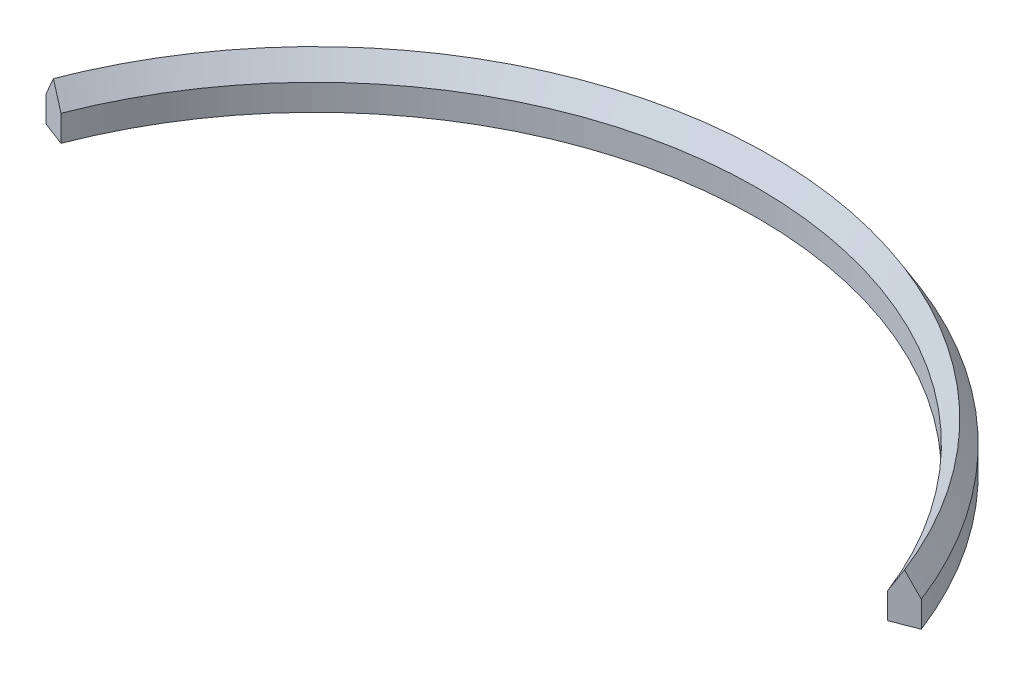
ISO-10303-21;
HEADER;
FILE_DESCRIPTION(('STEP AP214'),'2;1');
FILE_NAME('part.step','',(''),(''),'','','');
FILE_SCHEMA(('AUTOMOTIVE_DESIGN { 1 0 10303 214 1 1 1 1 }'));
ENDSEC;
DATA;
#1=APPLICATION_CONTEXT('core data for automotive mechanical design processes');
#2=APPLICATION_PROTOCOL_DEFINITION('international standard','automotive_design',2000,#1);
#3=PRODUCT_CONTEXT('',#1,'mechanical');
#4=PRODUCT('Part','Part','',(#3));
#5=PRODUCT_RELATED_PRODUCT_CATEGORY('part','',(#4));
#6=PRODUCT_DEFINITION_FORMATION('','',#4);
#7=PRODUCT_DEFINITION_CONTEXT('part definition',#1,'design');
#8=PRODUCT_DEFINITION('design','',#6,#7);
#9=PRODUCT_DEFINITION_SHAPE('','',#8);
#10=(LENGTH_UNIT() NAMED_UNIT(*) SI_UNIT(.MILLI.,.METRE.));
#11=(NAMED_UNIT(*) PLANE_ANGLE_UNIT() SI_UNIT($,.RADIAN.));
#12=(NAMED_UNIT(*) SI_UNIT($,.STERADIAN.) SOLID_ANGLE_UNIT());
#13=UNCERTAINTY_MEASURE_WITH_UNIT(LENGTH_MEASURE(1.E-05),#10,'distance_accuracy_value','');
#14=(GEOMETRIC_REPRESENTATION_CONTEXT(3) GLOBAL_UNCERTAINTY_ASSIGNED_CONTEXT((#13)) GLOBAL_UNIT_ASSIGNED_CONTEXT((#10,
#11,#12)) REPRESENTATION_CONTEXT('',''));
#15=CARTESIAN_POINT('',(0.,0.,0.));
#16=DIRECTION('',(0.,0.,1.));
#17=DIRECTION('',(1.,0.,0.));
#18=AXIS2_PLACEMENT_3D('',#15,#16,#17);
#19=CARTESIAN_POINT('',(0.,0.,0.));
#20=DIRECTION('',(0.359850178890878,0.,0.933010101098698));
#21=DIRECTION('',(0.933010101098698,0.,-0.359850178890878));
#22=AXIS2_PLACEMENT_3D('',#19,#20,#21);
#23=PLANE('',#22);
#24=DIRECTION('',(0.,-1.,0.));
#25=VECTOR('',#24,1.);
#26=CARTESIAN_POINT('',(40.3696121213184,1.2,-15.5700480911246));
#27=LINE('',#26,#25);
#28=CARTESIAN_POINT('',(40.3696121213184,1.2,-15.5700480911246));
#29=VERTEX_POINT('',#28);
#30=CARTESIAN_POINT('',(40.3696121213184,-1.2,-15.5700480911246));
#31=VERTEX_POINT('',#30);
#32=EDGE_CURVE('E86',#29,#31,#27,.T.);
#33=ORIENTED_EDGE('',*,*,#32,.F.);
#34=DIRECTION('',(0.480029736786288,-0.857492925712544,-0.185141389629193));
#35=VECTOR('',#34,1.);
#36=CARTESIAN_POINT('',(40.3696121213184,1.2,-15.5700480911246));
#37=LINE('',#36,#35);
#38=CARTESIAN_POINT('',(39.25,3.2,-15.1382278764555));
#39=VERTEX_POINT('',#38);
#40=EDGE_CURVE('E68',#39,#29,#37,.T.);
#41=ORIENTED_EDGE('',*,*,#40,.F.);
#42=DIRECTION('',(0.480029736786288,0.857492925712544,-0.185141389629193));
#43=VECTOR('',#42,1.);
#44=CARTESIAN_POINT('',(39.25,3.2,-15.1382278764555));
#45=LINE('',#44,#43);
#46=CARTESIAN_POINT('',(38.1303878786816,1.2,-14.7064076617865));
#47=VERTEX_POINT('',#46);
#48=EDGE_CURVE('E73',#47,#39,#45,.T.);
#49=ORIENTED_EDGE('',*,*,#48,.F.);
#50=DIRECTION('',(0.,1.,0.));
#51=VECTOR('',#50,1.);
#52=CARTESIAN_POINT('',(38.1303878786816,1.2,-14.7064076617865));
#53=LINE('',#52,#51);
#54=CARTESIAN_POINT('',(38.1303878786816,-1.2,-14.7064076617865));
#55=VERTEX_POINT('',#54);
#56=EDGE_CURVE('E78',#55,#47,#53,.T.);
#57=ORIENTED_EDGE('',*,*,#56,.F.);
#58=DIRECTION('',(-0.933010101098698,0.,0.359850178890878));
#59=VECTOR('',#58,1.);
#60=CARTESIAN_POINT('',(38.1303878786816,-1.2,-14.7064076617865));
#61=LINE('',#60,#59);
#62=EDGE_CURVE('E87',#31,#55,#61,.T.);
#63=ORIENTED_EDGE('',*,*,#62,.F.);
#64=EDGE_LOOP('',(#33,#41,#49,#57,#63));
#65=FACE_BOUND('',#64,.T.);
#66=ADVANCED_FACE('F37',(#65),#23,.T.);
#67=CARTESIAN_POINT('',(0.,0.,0.));
#68=DIRECTION('',(0.359850178890876,0.,-0.933010101098699));
#69=DIRECTION('',(-0.933010101098699,0.,-0.359850178890876));
#70=AXIS2_PLACEMENT_3D('',#67,#68,#69);
#71=PLANE('',#70);
#72=DIRECTION('',(0.,-1.,0.));
#73=VECTOR('',#72,1.);
#74=CARTESIAN_POINT('',(-40.3696121213185,1.2,-15.5700480911246));
#75=LINE('',#74,#73);
#76=CARTESIAN_POINT('',(-40.3696121213185,1.2,-15.5700480911246));
#77=VERTEX_POINT('',#76);
#78=CARTESIAN_POINT('',(-40.3696121213185,-1.2,-15.5700480911246));
#79=VERTEX_POINT('',#78);
#80=EDGE_CURVE('E101',#77,#79,#75,.T.);
#81=ORIENTED_EDGE('',*,*,#80,.T.);
#82=DIRECTION('',(0.933010101098699,0.,0.359850178890876));
#83=VECTOR('',#82,1.);
#84=CARTESIAN_POINT('',(-38.1303878786816,-1.2,-14.7064076617865));
#85=LINE('',#84,#83);
#86=CARTESIAN_POINT('',(-38.1303878786816,-1.2,-14.7064076617865));
#87=VERTEX_POINT('',#86);
#88=EDGE_CURVE('E108',#79,#87,#85,.T.);
#89=ORIENTED_EDGE('',*,*,#88,.T.);
#90=DIRECTION('',(0.,1.,0.));
#91=VECTOR('',#90,1.);
#92=CARTESIAN_POINT('',(-38.1303878786816,1.2,-14.7064076617865));
#93=LINE('',#92,#91);
#94=CARTESIAN_POINT('',(-38.1303878786816,1.2,-14.7064076617865));
#95=VERTEX_POINT('',#94);
#96=EDGE_CURVE('E56',#87,#95,#93,.T.);
#97=ORIENTED_EDGE('',*,*,#96,.T.);
#98=DIRECTION('',(-0.480029736786288,0.857492925712544,-0.185141389629192));
#99=VECTOR('',#98,1.);
#100=CARTESIAN_POINT('',(-39.25,3.2,-15.1382278764555));
#101=LINE('',#100,#99);
#102=CARTESIAN_POINT('',(-39.25,3.2,-15.1382278764555));
#103=VERTEX_POINT('',#102);
#104=EDGE_CURVE('E50',#95,#103,#101,.T.);
#105=ORIENTED_EDGE('',*,*,#104,.T.);
#106=DIRECTION('',(-0.480029736786288,-0.857492925712544,-0.185141389629192));
#107=VECTOR('',#106,1.);
#108=CARTESIAN_POINT('',(-40.3696121213185,1.2,-15.5700480911246));
#109=LINE('',#108,#107);
#110=EDGE_CURVE('E11',#103,#77,#109,.T.);
#111=ORIENTED_EDGE('',*,*,#110,.T.);
#112=EDGE_LOOP('',(#81,#89,#97,#105,#111));
#113=FACE_BOUND('',#112,.T.);
#114=ADVANCED_FACE('F129',(#113),#71,.F.);
#115=CARTESIAN_POINT('',(0.,0.,0.));
#116=DIRECTION('',(0.,1.,0.));
#117=DIRECTION('',(0.,0.,1.));
#118=AXIS2_PLACEMENT_3D('',#115,#116,#117);
#119=CYLINDRICAL_SURFACE('',#118,43.2681404775573);
#120=CARTESIAN_POINT('',(0.,-1.2,0.));
#121=DIRECTION('',(0.,1.,0.));
#122=DIRECTION('',(0.933010101098699,0.,-0.359850178890877));
#123=AXIS2_PLACEMENT_3D('',#120,#121,#122);
#124=CIRCLE('',#123,43.2681404775573);
#125=EDGE_CURVE('E103',#31,#79,#124,.T.);
#126=ORIENTED_EDGE('',*,*,#125,.T.);
#127=ORIENTED_EDGE('',*,*,#80,.F.);
#128=CARTESIAN_POINT('',(0.,1.2,0.));
#129=DIRECTION('',(0.,1.,0.));
#130=DIRECTION('',(0.933010101098699,0.,-0.359850178890877));
#131=AXIS2_PLACEMENT_3D('',#128,#129,#130);
#132=CIRCLE('',#131,43.2681404775573);
#133=EDGE_CURVE('E97',#29,#77,#132,.T.);
#134=ORIENTED_EDGE('',*,*,#133,.F.);
#135=ORIENTED_EDGE('',*,*,#32,.T.);
#136=EDGE_LOOP('',(#126,#127,#134,#135));
#137=FACE_BOUND('',#136,.T.);
#138=ADVANCED_FACE('F100',(#137),#119,.T.);
#139=CARTESIAN_POINT('',(38.1303878786816,-1.2,-14.7064076617865));
#140=DIRECTION('',(0.,-1.,0.));
#141=DIRECTION('',(0.,0.,-1.));
#142=AXIS2_PLACEMENT_3D('',#139,#140,#141);
#143=PLANE('',#142);
#144=CARTESIAN_POINT('',(0.,-1.2,0.));
#145=DIRECTION('',(0.,1.,0.));
#146=DIRECTION('',(0.933010101098699,0.,-0.359850178890877));
#147=AXIS2_PLACEMENT_3D('',#144,#145,#146);
#148=CIRCLE('',#147,40.8681404775573);
#149=EDGE_CURVE('E110',#55,#87,#148,.T.);
#150=ORIENTED_EDGE('',*,*,#149,.T.);
#151=ORIENTED_EDGE('',*,*,#88,.F.);
#152=ORIENTED_EDGE('',*,*,#125,.F.);
#153=ORIENTED_EDGE('',*,*,#62,.T.);
#154=EDGE_LOOP('',(#150,#151,#152,#153));
#155=FACE_BOUND('',#154,.T.);
#156=ADVANCED_FACE('F128',(#155),#143,.T.);
#157=CARTESIAN_POINT('',(0.,0.,0.));
#158=DIRECTION('',(0.,1.,0.));
#159=DIRECTION('',(0.,0.,1.));
#160=AXIS2_PLACEMENT_3D('',#157,#158,#159);
#161=CYLINDRICAL_SURFACE('',#160,40.8681404775573);
#162=CARTESIAN_POINT('',(0.,1.2,0.));
#163=DIRECTION('',(0.,1.,0.));
#164=DIRECTION('',(0.933010101098699,0.,-0.359850178890877));
#165=AXIS2_PLACEMENT_3D('',#162,#163,#164);
#166=CIRCLE('',#165,40.8681404775573);
#167=EDGE_CURVE('E115',#47,#95,#166,.T.);
#168=ORIENTED_EDGE('',*,*,#167,.T.);
#169=ORIENTED_EDGE('',*,*,#96,.F.);
#170=ORIENTED_EDGE('',*,*,#149,.F.);
#171=ORIENTED_EDGE('',*,*,#56,.T.);
#172=EDGE_LOOP('',(#168,#169,#170,#171));
#173=FACE_BOUND('',#172,.T.);
#174=ADVANCED_FACE('F124',(#173),#161,.F.);
#175=CARTESIAN_POINT('',(0.,1.2,0.));
#176=DIRECTION('',(0.,1.,0.));
#177=DIRECTION('',(0.,0.,1.));
#178=AXIS2_PLACEMENT_3D('',#175,#176,#177);
#179=CONICAL_SURFACE('',#178,40.8681404775573,0.540419500270584);
#180=CARTESIAN_POINT('',(0.,3.2,0.));
#181=DIRECTION('',(0.,1.,0.));
#182=DIRECTION('',(0.933010101098699,0.,-0.359850178890877));
#183=AXIS2_PLACEMENT_3D('',#180,#181,#182);
#184=CIRCLE('',#183,42.0681404775573);
#185=EDGE_CURVE('E44',#39,#103,#184,.T.);
#186=ORIENTED_EDGE('',*,*,#185,.T.);
#187=ORIENTED_EDGE('',*,*,#104,.F.);
#188=ORIENTED_EDGE('',*,*,#167,.F.);
#189=ORIENTED_EDGE('',*,*,#48,.T.);
#190=EDGE_LOOP('',(#186,#187,#188,#189));
#191=FACE_BOUND('',#190,.T.);
#192=ADVANCED_FACE('F121',(#191),#179,.F.);
#193=CARTESIAN_POINT('',(0.,3.2,0.));
#194=DIRECTION('',(0.,-1.,0.));
#195=DIRECTION('',(0.,0.,-1.));
#196=AXIS2_PLACEMENT_3D('',#193,#194,#195);
#197=CONICAL_SURFACE('',#196,42.0681404775573,0.540419500270584);
#198=ORIENTED_EDGE('',*,*,#110,.F.);
#199=ORIENTED_EDGE('',*,*,#185,.F.);
#200=ORIENTED_EDGE('',*,*,#40,.T.);
#201=ORIENTED_EDGE('',*,*,#133,.T.);
#202=EDGE_LOOP('',(#198,#199,#200,#201));
#203=FACE_BOUND('',#202,.T.);
#204=ADVANCED_FACE('F96',(#203),#197,.T.);
#205=CLOSED_SHELL('',(#66,#114,#138,#156,#174,#192,#204));
#206=MANIFOLD_SOLID_BREP('B2',#205);
#207=ADVANCED_BREP_SHAPE_REPRESENTATION('',(#18,#206),#14);
#208=SHAPE_DEFINITION_REPRESENTATION(#9,#207);
ENDSEC;
END-ISO-10303-21;
